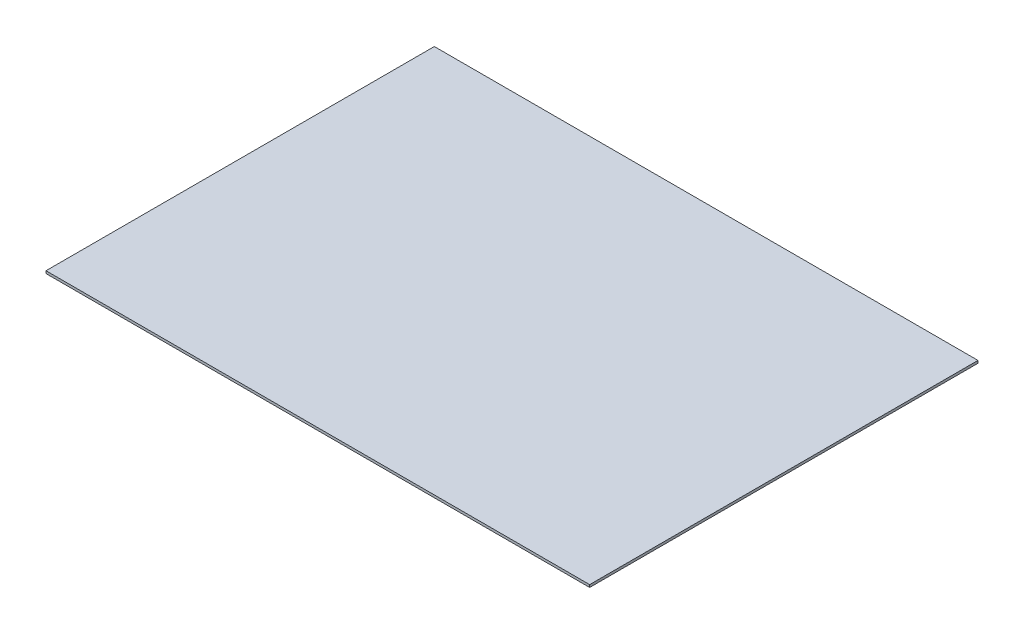
ISO-10303-21;
HEADER;
FILE_DESCRIPTION(('STEP AP214'),'2;1');
FILE_NAME('part.step','',(''),(''),'','','');
FILE_SCHEMA(('AUTOMOTIVE_DESIGN { 1 0 10303 214 1 1 1 1 }'));
ENDSEC;
DATA;
#1=APPLICATION_CONTEXT('core data for automotive mechanical design processes');
#2=APPLICATION_PROTOCOL_DEFINITION('international standard','automotive_design',2000,#1);
#3=PRODUCT_CONTEXT('',#1,'mechanical');
#4=PRODUCT('Part','Part','',(#3));
#5=PRODUCT_RELATED_PRODUCT_CATEGORY('part','',(#4));
#6=PRODUCT_DEFINITION_FORMATION('','',#4);
#7=PRODUCT_DEFINITION_CONTEXT('part definition',#1,'design');
#8=PRODUCT_DEFINITION('design','',#6,#7);
#9=PRODUCT_DEFINITION_SHAPE('','',#8);
#10=(LENGTH_UNIT() NAMED_UNIT(*) SI_UNIT(.MILLI.,.METRE.));
#11=(NAMED_UNIT(*) PLANE_ANGLE_UNIT() SI_UNIT($,.RADIAN.));
#12=(NAMED_UNIT(*) SI_UNIT($,.STERADIAN.) SOLID_ANGLE_UNIT());
#13=UNCERTAINTY_MEASURE_WITH_UNIT(LENGTH_MEASURE(1.E-05),#10,'distance_accuracy_value','');
#14=(GEOMETRIC_REPRESENTATION_CONTEXT(3) GLOBAL_UNCERTAINTY_ASSIGNED_CONTEXT((#13)) GLOBAL_UNIT_ASSIGNED_CONTEXT((#10,
#11,#12)) REPRESENTATION_CONTEXT('',''));
#15=CARTESIAN_POINT('',(0.,0.,0.));
#16=DIRECTION('',(0.,0.,1.));
#17=DIRECTION('',(1.,0.,0.));
#18=AXIS2_PLACEMENT_3D('',#15,#16,#17);
#19=CARTESIAN_POINT('',(-350.,3.2,250.));
#20=DIRECTION('',(1.,0.,0.));
#21=DIRECTION('',(0.,0.,-1.));
#22=AXIS2_PLACEMENT_3D('',#19,#20,#21);
#23=PLANE('',#22);
#24=DIRECTION('',(0.,0.,1.));
#25=VECTOR('',#24,1.);
#26=CARTESIAN_POINT('',(-350.,0.,250.));
#27=LINE('',#26,#25);
#28=CARTESIAN_POINT('',(-350.,0.,-250.));
#29=VERTEX_POINT('',#28);
#30=CARTESIAN_POINT('',(-350.,0.,250.));
#31=VERTEX_POINT('',#30);
#32=EDGE_CURVE('E96',#29,#31,#27,.T.);
#33=ORIENTED_EDGE('',*,*,#32,.T.);
#34=DIRECTION('',(0.,-1.,0.));
#35=VECTOR('',#34,1.);
#36=CARTESIAN_POINT('',(-350.,3.2,250.));
#37=LINE('',#36,#35);
#38=CARTESIAN_POINT('',(-350.,3.2,250.));
#39=VERTEX_POINT('',#38);
#40=EDGE_CURVE('E11',#39,#31,#37,.T.);
#41=ORIENTED_EDGE('',*,*,#40,.F.);
#42=DIRECTION('',(0.,0.,1.));
#43=VECTOR('',#42,1.);
#44=CARTESIAN_POINT('',(-350.,3.2,250.));
#45=LINE('',#44,#43);
#46=CARTESIAN_POINT('',(-350.,3.2,-250.));
#47=VERTEX_POINT('',#46);
#48=EDGE_CURVE('E84',#47,#39,#45,.T.);
#49=ORIENTED_EDGE('',*,*,#48,.F.);
#50=DIRECTION('',(0.,-1.,0.));
#51=VECTOR('',#50,1.);
#52=CARTESIAN_POINT('',(-350.,3.2,-250.));
#53=LINE('',#52,#51);
#54=EDGE_CURVE('E92',#47,#29,#53,.T.);
#55=ORIENTED_EDGE('',*,*,#54,.T.);
#56=EDGE_LOOP('',(#33,#41,#49,#55));
#57=FACE_BOUND('',#56,.T.);
#58=ADVANCED_FACE('F33',(#57),#23,.F.);
#59=CARTESIAN_POINT('',(350.,3.2,250.));
#60=DIRECTION('',(0.,0.,-1.));
#61=DIRECTION('',(-1.,0.,0.));
#62=AXIS2_PLACEMENT_3D('',#59,#60,#61);
#63=PLANE('',#62);
#64=DIRECTION('',(1.,0.,0.));
#65=VECTOR('',#64,1.);
#66=CARTESIAN_POINT('',(350.,0.,250.));
#67=LINE('',#66,#65);
#68=CARTESIAN_POINT('',(350.,0.,250.));
#69=VERTEX_POINT('',#68);
#70=EDGE_CURVE('E88',#31,#69,#67,.T.);
#71=ORIENTED_EDGE('',*,*,#70,.T.);
#72=DIRECTION('',(0.,-1.,0.));
#73=VECTOR('',#72,1.);
#74=CARTESIAN_POINT('',(350.,3.2,250.));
#75=LINE('',#74,#73);
#76=CARTESIAN_POINT('',(350.,3.2,250.));
#77=VERTEX_POINT('',#76);
#78=EDGE_CURVE('E41',#77,#69,#75,.T.);
#79=ORIENTED_EDGE('',*,*,#78,.F.);
#80=DIRECTION('',(1.,0.,0.));
#81=VECTOR('',#80,1.);
#82=CARTESIAN_POINT('',(350.,3.2,250.));
#83=LINE('',#82,#81);
#84=EDGE_CURVE('E79',#39,#77,#83,.T.);
#85=ORIENTED_EDGE('',*,*,#84,.F.);
#86=ORIENTED_EDGE('',*,*,#40,.T.);
#87=EDGE_LOOP('',(#71,#79,#85,#86));
#88=FACE_BOUND('',#87,.T.);
#89=ADVANCED_FACE('F87',(#88),#63,.F.);
#90=CARTESIAN_POINT('',(350.,3.2,250.));
#91=DIRECTION('',(-1.,0.,0.));
#92=DIRECTION('',(0.,0.,1.));
#93=AXIS2_PLACEMENT_3D('',#90,#91,#92);
#94=PLANE('',#93);
#95=DIRECTION('',(0.,0.,-1.));
#96=VECTOR('',#95,1.);
#97=CARTESIAN_POINT('',(350.,0.,250.));
#98=LINE('',#97,#96);
#99=CARTESIAN_POINT('',(350.,0.,-250.));
#100=VERTEX_POINT('',#99);
#101=EDGE_CURVE('E66',#69,#100,#98,.T.);
#102=ORIENTED_EDGE('',*,*,#101,.T.);
#103=DIRECTION('',(0.,-1.,0.));
#104=VECTOR('',#103,1.);
#105=CARTESIAN_POINT('',(350.,3.2,-250.));
#106=LINE('',#105,#104);
#107=CARTESIAN_POINT('',(350.,3.2,-250.));
#108=VERTEX_POINT('',#107);
#109=EDGE_CURVE('E89',#108,#100,#106,.T.);
#110=ORIENTED_EDGE('',*,*,#109,.F.);
#111=DIRECTION('',(0.,0.,-1.));
#112=VECTOR('',#111,1.);
#113=CARTESIAN_POINT('',(350.,3.2,250.));
#114=LINE('',#113,#112);
#115=EDGE_CURVE('E82',#77,#108,#114,.T.);
#116=ORIENTED_EDGE('',*,*,#115,.F.);
#117=ORIENTED_EDGE('',*,*,#78,.T.);
#118=EDGE_LOOP('',(#102,#110,#116,#117));
#119=FACE_BOUND('',#118,.T.);
#120=ADVANCED_FACE('F90',(#119),#94,.F.);
#121=CARTESIAN_POINT('',(350.,3.2,-250.));
#122=DIRECTION('',(0.,0.,1.));
#123=DIRECTION('',(1.,0.,0.));
#124=AXIS2_PLACEMENT_3D('',#121,#122,#123);
#125=PLANE('',#124);
#126=DIRECTION('',(-1.,0.,0.));
#127=VECTOR('',#126,1.);
#128=CARTESIAN_POINT('',(350.,0.,-250.));
#129=LINE('',#128,#127);
#130=EDGE_CURVE('E72',#100,#29,#129,.T.);
#131=ORIENTED_EDGE('',*,*,#130,.T.);
#132=ORIENTED_EDGE('',*,*,#54,.F.);
#133=DIRECTION('',(-1.,0.,0.));
#134=VECTOR('',#133,1.);
#135=CARTESIAN_POINT('',(350.,3.2,-250.));
#136=LINE('',#135,#134);
#137=EDGE_CURVE('E49',#108,#47,#136,.T.);
#138=ORIENTED_EDGE('',*,*,#137,.F.);
#139=ORIENTED_EDGE('',*,*,#109,.T.);
#140=EDGE_LOOP('',(#131,#132,#138,#139));
#141=FACE_BOUND('',#140,.T.);
#142=ADVANCED_FACE('F103',(#141),#125,.F.);
#143=CARTESIAN_POINT('',(0.,3.2,0.));
#144=DIRECTION('',(0.,1.,0.));
#145=DIRECTION('',(0.,0.,1.));
#146=AXIS2_PLACEMENT_3D('',#143,#144,#145);
#147=PLANE('',#146);
#148=ORIENTED_EDGE('',*,*,#48,.T.);
#149=ORIENTED_EDGE('',*,*,#84,.T.);
#150=ORIENTED_EDGE('',*,*,#115,.T.);
#151=ORIENTED_EDGE('',*,*,#137,.T.);
#152=EDGE_LOOP('',(#148,#149,#150,#151));
#153=FACE_BOUND('',#152,.T.);
#154=ADVANCED_FACE('F80',(#153),#147,.T.);
#155=CARTESIAN_POINT('',(0.,0.,0.));
#156=DIRECTION('',(0.,1.,0.));
#157=DIRECTION('',(0.,0.,1.));
#158=AXIS2_PLACEMENT_3D('',#155,#156,#157);
#159=PLANE('',#158);
#160=ORIENTED_EDGE('',*,*,#32,.F.);
#161=ORIENTED_EDGE('',*,*,#130,.F.);
#162=ORIENTED_EDGE('',*,*,#101,.F.);
#163=ORIENTED_EDGE('',*,*,#70,.F.);
#164=EDGE_LOOP('',(#160,#161,#162,#163));
#165=FACE_BOUND('',#164,.T.);
#166=ADVANCED_FACE('F106',(#165),#159,.F.);
#167=CLOSED_SHELL('',(#58,#89,#120,#142,#154,#166));
#168=MANIFOLD_SOLID_BREP('B2',#167);
#169=ADVANCED_BREP_SHAPE_REPRESENTATION('',(#18,#168),#14);
#170=SHAPE_DEFINITION_REPRESENTATION(#9,#169);
ENDSEC;
END-ISO-10303-21;
